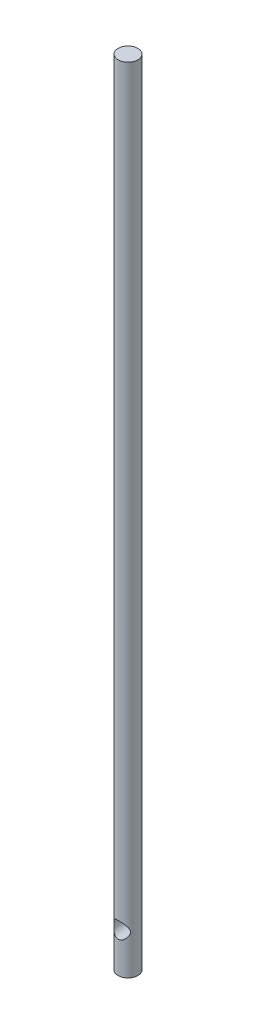
ISO-10303-21;
HEADER;
FILE_DESCRIPTION(('STEP AP214'),'2;1');
FILE_NAME('part.step','',(''),(''),'','','');
FILE_SCHEMA(('AUTOMOTIVE_DESIGN { 1 0 10303 214 1 1 1 1 }'));
ENDSEC;
DATA;
#1=APPLICATION_CONTEXT('core data for automotive mechanical design processes');
#2=APPLICATION_PROTOCOL_DEFINITION('international standard','automotive_design',2000,#1);
#3=PRODUCT_CONTEXT('',#1,'mechanical');
#4=PRODUCT('Part','Part','',(#3));
#5=PRODUCT_RELATED_PRODUCT_CATEGORY('part','',(#4));
#6=PRODUCT_DEFINITION_FORMATION('','',#4);
#7=PRODUCT_DEFINITION_CONTEXT('part definition',#1,'design');
#8=PRODUCT_DEFINITION('design','',#6,#7);
#9=PRODUCT_DEFINITION_SHAPE('','',#8);
#10=(LENGTH_UNIT() NAMED_UNIT(*) SI_UNIT(.MILLI.,.METRE.));
#11=(NAMED_UNIT(*) PLANE_ANGLE_UNIT() SI_UNIT($,.RADIAN.));
#12=(NAMED_UNIT(*) SI_UNIT($,.STERADIAN.) SOLID_ANGLE_UNIT());
#13=UNCERTAINTY_MEASURE_WITH_UNIT(LENGTH_MEASURE(1.E-05),#10,'distance_accuracy_value','');
#14=(GEOMETRIC_REPRESENTATION_CONTEXT(3) GLOBAL_UNCERTAINTY_ASSIGNED_CONTEXT((#13)) GLOBAL_UNIT_ASSIGNED_CONTEXT((#10,
#11,#12)) REPRESENTATION_CONTEXT('',''));
#15=CARTESIAN_POINT('',(0.,0.,0.));
#16=DIRECTION('',(0.,0.,1.));
#17=DIRECTION('',(1.,0.,0.));
#18=AXIS2_PLACEMENT_3D('',#15,#16,#17);
#19=CARTESIAN_POINT('',(0.,254.,0.));
#20=DIRECTION('',(0.,-1.,0.));
#21=DIRECTION('',(0.,0.,-1.));
#22=AXIS2_PLACEMENT_3D('',#19,#20,#21);
#23=CYLINDRICAL_SURFACE('',#22,3.175);
#24=CARTESIAN_POINT('',(0.,254.,0.));
#25=DIRECTION('',(0.,1.,0.));
#26=DIRECTION('',(0.,0.,1.));
#27=AXIS2_PLACEMENT_3D('',#24,#25,#26);
#28=CIRCLE('',#27,3.175);
#29=CARTESIAN_POINT('',(0.,254.,3.175));
#30=VERTEX_POINT('',#29);
#31=EDGE_CURVE('E10',#30,#30,#28,.T.);
#32=ORIENTED_EDGE('',*,*,#31,.F.);
#33=EDGE_LOOP('',(#32));
#34=FACE_BOUND('',#33,.T.);
#35=CARTESIAN_POINT('',(0.,0.,0.));
#36=DIRECTION('',(0.,1.,0.));
#37=DIRECTION('',(0.,0.,1.));
#38=AXIS2_PLACEMENT_3D('',#35,#36,#37);
#39=CIRCLE('',#38,3.175);
#40=CARTESIAN_POINT('',(0.,0.,3.175));
#41=VERTEX_POINT('',#40);
#42=EDGE_CURVE('E46',#41,#41,#39,.T.);
#43=ORIENTED_EDGE('',*,*,#42,.T.);
#44=EDGE_LOOP('',(#43));
#45=FACE_BOUND('',#44,.T.);
#46=CARTESIAN_POINT('',(-2.6035,12.7,1.81725417869928));
#47=CARTESIAN_POINT('',(-2.60349380703893,12.6056522915322,1.81726960519073));
#48=CARTESIAN_POINT('',(-2.59830904840763,12.5111405078217,1.82475945800133));
#49=CARTESIAN_POINT('',(-2.57808860042119,12.3251602366585,1.85320291134145));
#50=CARTESIAN_POINT('',(-2.56301943103733,12.2337032065457,1.87420226598136));
#51=CARTESIAN_POINT('',(-2.51694337247042,12.022627240234,1.93586405062697));
#52=CARTESIAN_POINT('',(-2.48209442276684,11.9051761393774,1.9809339390405));
#53=CARTESIAN_POINT('',(-2.39841904985947,11.6800407597469,2.08146538459981));
#54=CARTESIAN_POINT('',(-2.34954960473287,11.572387907154,2.13695874238255));
#55=CARTESIAN_POINT('',(-2.25541715860351,11.3969043389212,2.23537692454373));
#56=CARTESIAN_POINT('',(-2.2133430346896,11.3266945022097,2.27718022507128));
#57=CARTESIAN_POINT('',(-2.12304867110549,11.1908489097998,2.36159191688069));
#58=CARTESIAN_POINT('',(-2.07482597637227,11.1252149975039,2.40420062393305));
#59=CARTESIAN_POINT('',(-1.92114005012042,10.9353666398222,2.53129287769606));
#60=CARTESIAN_POINT('',(-1.80650430308042,10.8179184294719,2.61521372312124));
#61=CARTESIAN_POINT('',(-1.57945159624831,10.62615817513,2.75681725436884));
#62=CARTESIAN_POINT('',(-1.47145254679039,10.5479453202648,2.8163418253493));
#63=CARTESIAN_POINT('',(-1.24097732698785,10.40733046106,2.92519319791981));
#64=CARTESIAN_POINT('',(-1.11852469347476,10.3449032578057,2.97453622901349));
#65=CARTESIAN_POINT('',(-0.882754596866585,10.2479896804999,3.05189691940021));
#66=CARTESIAN_POINT('',(-0.771369427082402,10.2105688311945,3.08210619165948));
#67=CARTESIAN_POINT('',(-0.542099638614502,10.150815481225,3.13056626479759));
#68=CARTESIAN_POINT('',(-0.424218717568863,10.1284744905443,3.14882379437707));
#69=CARTESIAN_POINT('',(-0.184702399776175,10.1002525297829,3.17191312658879));
#70=CARTESIAN_POINT('',(-0.0630542442020657,10.0944355623768,3.17669272448434));
#71=CARTESIAN_POINT('',(0.17959843960946,10.0998688596393,3.1722376933656));
#72=CARTESIAN_POINT('',(0.300602973008788,10.1111189872204,3.16300317691645));
#73=CARTESIAN_POINT('',(0.530754495807862,10.1486722187031,3.13234403759877));
#74=CARTESIAN_POINT('',(0.640171714002752,10.1739998535061,3.1117098386675));
#75=CARTESIAN_POINT('',(0.852647558606556,10.237579592308,3.06032310242028));
#76=CARTESIAN_POINT('',(0.955704504285416,10.2758350954051,3.0295679040662));
#77=CARTESIAN_POINT('',(1.16279452849434,10.3676001702961,2.95662894565898));
#78=CARTESIAN_POINT('',(1.2660745726746,10.4221756446305,2.91366368632402));
#79=CARTESIAN_POINT('',(1.46207443006603,10.5427311167065,2.82041889385542));
#80=CARTESIAN_POINT('',(1.55478943860704,10.608716269169,2.77013605638324));
#81=CARTESIAN_POINT('',(1.74736466909495,10.7652216438746,2.65376673632885));
#82=CARTESIAN_POINT('',(1.84471745269194,10.8579919915534,2.58656568240451));
#83=CARTESIAN_POINT('',(2.02339604233255,11.0562445223615,2.44932530286629));
#84=CARTESIAN_POINT('',(2.10469763983113,11.1617455256786,2.37928187928248));
#85=CARTESIAN_POINT('',(2.24848726914475,11.3812196890884,2.24373588676196));
#86=CARTESIAN_POINT('',(2.31150741926269,11.4947985976659,2.1781597457541));
#87=CARTESIAN_POINT('',(2.421176492926,11.7338994443531,2.05553877920543));
#88=CARTESIAN_POINT('',(2.46786131888551,11.8593944105906,1.99847540447658));
#89=CARTESIAN_POINT('',(2.52912696585605,12.0759078545479,1.91981912423537));
#90=CARTESIAN_POINT('',(2.54922138731441,12.1633570383594,1.89282496311961));
#91=CARTESIAN_POINT('',(2.58042133786671,12.3424311995639,1.85007036811106));
#92=CARTESIAN_POINT('',(2.59154938910397,12.4340450997925,1.83428179946868));
#93=CARTESIAN_POINT('',(2.60395334095436,12.6201217578389,1.81664298167926));
#94=CARTESIAN_POINT('',(2.60514737674104,12.7146017602056,1.81490855376892));
#95=CARTESIAN_POINT('',(2.59733303011709,12.9023006848884,1.82606625849704));
#96=CARTESIAN_POINT('',(2.58831318049629,12.995518070649,1.83897483097672));
#97=CARTESIAN_POINT('',(2.55818983228077,13.1961278594062,1.88070528016295));
#98=CARTESIAN_POINT('',(2.53503143895886,13.3026294075129,1.91219215437187));
#99=CARTESIAN_POINT('',(2.47715409814926,13.5083438569671,1.98658919501497));
#100=CARTESIAN_POINT('',(2.44239853217996,13.6075324405335,2.02953545771445));
#101=CARTESIAN_POINT('',(2.37187757105399,13.7764456503839,2.11116922838265));
#102=CARTESIAN_POINT('',(2.33818697759601,13.847696130628,2.14856077116875));
#103=CARTESIAN_POINT('',(2.26508109926628,13.9859784609942,2.22550176038988));
#104=CARTESIAN_POINT('',(2.22566296224328,14.0530081853242,2.26505227576864));
#105=CARTESIAN_POINT('',(2.09898018038973,14.24808755516,2.38503209760888));
#106=CARTESIAN_POINT('',(2.0033061695786,14.3700826149601,2.46676624298374));
#107=CARTESIAN_POINT('',(1.84210171074324,14.5415311546607,2.58688783587489));
#108=CARTESIAN_POINT('',(1.78450998934586,14.5974319232116,2.62704185301191));
#109=CARTESIAN_POINT('',(1.66355898166607,14.7043201667134,2.70524849645464));
#110=CARTESIAN_POINT('',(1.60019956353601,14.7553075292905,2.74330107469019));
#111=CARTESIAN_POINT('',(1.46797932136913,14.8517255573894,2.81626530862939));
#112=CARTESIAN_POINT('',(1.39913273588328,14.8971698770936,2.85118462395024));
#113=CARTESIAN_POINT('',(1.2560546202533,14.9819850768829,2.91704561602491));
#114=CARTESIAN_POINT('',(1.18182574004628,15.0213589162747,2.94798922966511));
#115=CARTESIAN_POINT('',(0.999413105069468,15.106859448454,3.01570335266716));
#116=CARTESIAN_POINT('',(0.888951563089914,15.14996386044,3.0502940300014));
#117=CARTESIAN_POINT('',(0.660433666577564,15.2211783058276,3.10778240966677));
#118=CARTESIAN_POINT('',(0.542383240561657,15.2492998882162,3.1306891175921));
#119=CARTESIAN_POINT('',(0.301034653873178,15.2889386678215,3.16304955150389));
#120=CARTESIAN_POINT('',(0.17771295827243,15.3003711105559,3.17243460571653));
#121=CARTESIAN_POINT('',(-0.0695487107797201,15.3055053283863,3.17664410680545));
#122=CARTESIAN_POINT('',(-0.193488604293607,15.2992093394575,3.17147038988767));
#123=CARTESIAN_POINT('',(-0.428208810946593,15.2705517809296,3.14802958864769));
#124=CARTESIAN_POINT('',(-0.539260005543841,15.2494857953008,3.13081865904161));
#125=CARTESIAN_POINT('',(-0.755647208780163,15.1939321240832,3.08574914882455));
#126=CARTESIAN_POINT('',(-0.86098238909654,15.1594424991261,3.0578890296919));
#127=CARTESIAN_POINT('',(-1.07072462242002,15.0759901930671,2.99116521603351));
#128=CARTESIAN_POINT('',(-1.17461764477316,15.0262266017417,2.95169965368096));
#129=CARTESIAN_POINT('',(-1.37254157716372,14.9152300957006,2.86504169788145));
#130=CARTESIAN_POINT('',(-1.46656491895476,14.8539884782238,2.81784344486658));
#131=CARTESIAN_POINT('',(-1.68524901110361,14.6910734064275,2.69493634929465));
#132=CARTESIAN_POINT('',(-1.80403918577009,14.5837795783829,2.61611808882817));
#133=CARTESIAN_POINT('',(-1.96516590073709,14.409567353474,2.49465758406211));
#134=CARTESIAN_POINT('',(-2.01609578271388,14.3491832441239,2.45356727170546));
#135=CARTESIAN_POINT('',(-2.11224457503145,14.2240887104516,2.37129603165292));
#136=CARTESIAN_POINT('',(-2.15746514344285,14.1593795505773,2.33011513381555));
#137=CARTESIAN_POINT('',(-2.26728826205007,13.985917221163,2.22458028123042));
#138=CARTESIAN_POINT('',(-2.32744666809876,13.8738351577155,2.16099283135988));
#139=CARTESIAN_POINT('',(-2.43194934699224,13.6382725322719,2.0426543650848));
#140=CARTESIAN_POINT('',(-2.47633599046081,13.5148236493447,1.98787989299024));
#141=CARTESIAN_POINT('',(-2.53529061200704,13.2988236228063,1.91166237827773));
#142=CARTESIAN_POINT('',(-2.55486432902738,13.2094574558188,1.88518150104208));
#143=CARTESIAN_POINT('',(-2.58457629617021,13.0266045031825,1.8442487329831));
#144=CARTESIAN_POINT('',(-2.59475037550997,12.9331347992831,1.82975118696474));
#145=CARTESIAN_POINT('',(-2.60102447982524,12.8158660417275,1.82079575180876));
#146=CARTESIAN_POINT('',(-2.60195127919733,12.7927266651667,1.81947139270039));
#147=CARTESIAN_POINT('',(-2.60318985311492,12.7463948389957,1.81769863473896));
#148=CARTESIAN_POINT('',(-2.60350152299875,12.723202381026,1.81725038495232));
#149=CARTESIAN_POINT('',(-2.6035,12.7,1.81725417869928));
#150=B_SPLINE_CURVE_WITH_KNOTS('',3,(#46,#47,#48,#49,#50,#51,#52,#53,#54,#55,#56,#57,#58,#59,
#60,#61,#62,#63,#64,#65,#66,#67,#68,#69,#70,#71,#72,#73,#74,#75,#76,#77,#78,#79,#80,#81,#82,#83,
#84,#85,#86,#87,#88,#89,#90,#91,#92,#93,#94,#95,#96,#97,#98,#99,#100,#101,#102,#103,#104,#105,
#106,#107,#108,#109,#110,#111,#112,#113,#114,#115,#116,#117,#118,#119,#120,#121,#122,#123,#124,
#125,#126,#127,#128,#129,#130,#131,#132,#133,#134,#135,#136,#137,#138,#139,#140,#141,#142,#143,
#144,#145,#146,#147,#148,#149),.UNSPECIFIED.,.T.,.F.,(4,2,2,2,2,2,2,2,2,2,2,2,2,2,2,2,2,2,2,2,2,
2,2,2,2,2,2,2,2,2,2,2,2,2,2,2,2,2,2,2,2,2,2,2,2,2,2,2,2,2,2,4),(0.,0.282939510307461,
0.566842363978402,0.956270704776369,1.34690702768739,1.62230695710978,1.89781719737606,
2.44774539088221,2.88426263354912,3.32007859335296,3.68252927239652,4.04477571977009,
4.40842335953074,4.77206807839133,5.11319028142708,5.45440224490685,5.82644196446266,
6.1986502072396,6.64806919839079,7.09816091444782,7.53340602702877,7.96768844192595,
8.24785671153458,8.52731902827849,8.80908209660933,9.09116181647814,9.42962283661693,
9.76916283494952,10.0305293359004,10.2920264387289,10.8151808853685,11.0841598691664,
11.3531450032797,11.6214535587844,11.8896308997666,12.2585823277594,12.6272489495626,
12.9977813798354,13.3682670792854,13.7097644119182,14.0513111003958,14.4152597845521,
14.7794855430674,15.3117004825252,15.5786168057556,15.8454554332829,16.2708086130978,
16.6950102905371,16.9797499495292,17.2633997147977,17.3329695404304,17.4025512020528),.UNSPECIFIED.);
#151=CARTESIAN_POINT('',(-2.6035,12.7,1.81725417869928));
#152=VERTEX_POINT('',#151);
#153=EDGE_CURVE('E52',#152,#152,#150,.T.);
#154=ORIENTED_EDGE('',*,*,#153,.F.);
#155=EDGE_LOOP('',(#154));
#156=FACE_BOUND('',#155,.T.);
#157=CARTESIAN_POINT('',(0.,15.3035,-3.175));
#158=CARTESIAN_POINT('',(0.124123475975316,15.3034893581908,-3.17498963844609));
#159=CARTESIAN_POINT('',(0.248399817811967,15.2945499532605,-3.16764822022756));
#160=CARTESIAN_POINT('',(0.492915685238949,15.2594097445048,-3.13893180286522));
#161=CARTESIAN_POINT('',(0.613147071737957,15.233176097969,-3.11753010274403));
#162=CARTESIAN_POINT('',(0.845370064526018,15.1653814220387,-3.06269871701765));
#163=CARTESIAN_POINT('',(0.957408835942439,15.123918058066,-3.02934570561062));
#164=CARTESIAN_POINT('',(1.1719899729014,15.0277668764952,-2.95297497446787));
#165=CARTESIAN_POINT('',(1.27453147910821,14.9730778638216,-2.90995638137086));
#166=CARTESIAN_POINT('',(1.50418874828168,14.8307009338172,-2.79992252111318));
#167=CARTESIAN_POINT('',(1.62685974340384,14.7382213815472,-2.72984396144292));
#168=CARTESIAN_POINT('',(1.85222572926917,14.5358996551492,-2.58226149625843));
#169=CARTESIAN_POINT('',(1.95486191966328,14.4260080387235,-2.50473670147969));
#170=CARTESIAN_POINT('',(2.09419892563397,14.2486486776039,-2.38720547545905));
#171=CARTESIAN_POINT('',(2.13853064808069,14.1868430792235,-2.34746698005741));
#172=CARTESIAN_POINT('',(2.22185003224186,14.0591943987958,-2.26876311834293));
#173=CARTESIAN_POINT('',(2.26083592730141,13.9933499923837,-2.2297980112354));
#174=CARTESIAN_POINT('',(2.33318274771518,13.8577398573863,-2.15397803623534));
#175=CARTESIAN_POINT('',(2.36655779505138,13.7879845812898,-2.11711802939653));
#176=CARTESIAN_POINT('',(2.42746797872266,13.6442963754813,-2.04699254721169));
#177=CARTESIAN_POINT('',(2.4550081415199,13.5703671115664,-2.01372399022972));
#178=CARTESIAN_POINT('',(2.50658873716791,13.40934482567,-1.94923911746055));
#179=CARTESIAN_POINT('',(2.52985620476328,13.3217181629825,-1.91870498324858));
#180=CARTESIAN_POINT('',(2.56739303486915,13.1417193499684,-1.86818689698901));
#181=CARTESIAN_POINT('',(2.58168481380992,13.0493596498964,-1.84817668237134));
#182=CARTESIAN_POINT('',(2.60028691219318,12.8605602665468,-1.82192817278465));
#183=CARTESIAN_POINT('',(2.60448888485103,12.7640875203457,-1.81583940257808));
#184=CARTESIAN_POINT('',(2.60211315740838,12.571537150346,-1.81923902416289));
#185=CARTESIAN_POINT('',(2.59553081649723,12.4754597144996,-1.82873412215904));
#186=CARTESIAN_POINT('',(2.57094397805907,12.2760690024166,-1.86315400856163));
#187=CARTESIAN_POINT('',(2.55170022727413,12.1732135391498,-1.88974469136245));
#188=CARTESIAN_POINT('',(2.50232253625902,11.9739084648961,-1.95464781624411));
#189=CARTESIAN_POINT('',(2.47215411497205,11.8774802940466,-1.992997312748));
#190=CARTESIAN_POINT('',(2.41011212928528,11.7123202113051,-2.06731302203853));
#191=CARTESIAN_POINT('',(2.38013051431427,11.6422189185222,-2.10189249500399));
#192=CARTESIAN_POINT('',(2.3147744528378,11.5059559661491,-2.17366213153368));
#193=CARTESIAN_POINT('',(2.27939711926159,11.4397964421815,-2.21085368695476));
#194=CARTESIAN_POINT('',(2.16543772342221,11.2469181152341,-2.32442703413847));
#195=CARTESIAN_POINT('',(2.07905422537912,11.1258671508787,-2.40277435290892));
#196=CARTESIAN_POINT('',(1.88227893075193,10.8946766809139,-2.56012511257142));
#197=CARTESIAN_POINT('',(1.77105880109226,10.7851748312205,-2.63902738873259));
#198=CARTESIAN_POINT('',(1.52707791149911,10.5855394009579,-2.78727841350138));
#199=CARTESIAN_POINT('',(1.39437058393798,10.4953590337454,-2.85665009058513));
#200=CARTESIAN_POINT('',(1.14717455706694,10.3598303714,-2.96269415784094));
#201=CARTESIAN_POINT('',(1.03734481071853,10.3089448591673,-3.00314655826614));
#202=CARTESIAN_POINT('',(0.808472770456197,10.2221942364831,-3.07266264818784));
#203=CARTESIAN_POINT('',(0.689437039605895,10.1863185401902,-3.10173436310676));
#204=CARTESIAN_POINT('',(0.444137934137701,10.1315699656462,-3.14626597447226));
#205=CARTESIAN_POINT('',(0.317832509624801,10.112809427501,-3.16163592073425));
#206=CARTESIAN_POINT('',(0.0629120037225274,10.0941295640756,-3.17693912736037));
#207=CARTESIAN_POINT('',(-0.0657020679860051,10.0942021936836,-3.17687897911894));
#208=CARTESIAN_POINT('',(-0.307380967024334,10.112164759431,-3.16216462368221));
#209=CARTESIAN_POINT('',(-0.420683678390816,10.1282200119678,-3.14901320282353));
#210=CARTESIAN_POINT('',(-0.642383248668994,10.1744534621768,-3.11136927044028));
#211=CARTESIAN_POINT('',(-0.75077921857971,10.2046342079558,-3.08687471272837));
#212=CARTESIAN_POINT('',(-0.964119386725462,10.2788642094524,-3.02717779548715));
#213=CARTESIAN_POINT('',(-1.06880671667246,10.3233653623829,-2.99162801371886));
#214=CARTESIAN_POINT('',(-1.26901924959805,10.4239559720396,-2.91235960230411));
#215=CARTESIAN_POINT('',(-1.36454176445306,10.4800488135904,-2.86863858697831));
#216=CARTESIAN_POINT('',(-1.58678190557676,10.6298485880595,-2.75401917991626));
#217=CARTESIAN_POINT('',(-1.70808861490191,10.7290981722438,-2.67976797972566));
#218=CARTESIAN_POINT('',(-1.87403957004748,10.8910751115127,-2.56382769666463));
#219=CARTESIAN_POINT('',(-1.92679707161641,10.9474043435339,-2.52431861471154));
#220=CARTESIAN_POINT('',(-2.02691784622181,11.0642350861497,-2.44464891997432));
#221=CARTESIAN_POINT('',(-2.07428337510764,11.1247348347821,-2.40448858774876));
#222=CARTESIAN_POINT('',(-2.16433735799769,11.2508734660719,-2.32378756743908));
#223=CARTESIAN_POINT('',(-2.20693199095684,11.3165825337329,-2.2832521174344));
#224=CARTESIAN_POINT('',(-2.28640153755374,11.4522954993897,-2.20366818575309));
#225=CARTESIAN_POINT('',(-2.32327376010173,11.522301396599,-2.16462041016165));
#226=CARTESIAN_POINT('',(-2.39086352498482,11.6664187065179,-2.08971969393378));
#227=CARTESIAN_POINT('',(-2.4216077188949,11.7405104687395,-2.05385331274569));
#228=CARTESIAN_POINT('',(-2.47664506007239,11.8931462093896,-1.98713910557181));
#229=CARTESIAN_POINT('',(-2.50094648664365,11.9716843148846,-1.95628485867469));
#230=CARTESIAN_POINT('',(-2.54327599370942,12.1365419418237,-1.90095794348242));
#231=CARTESIAN_POINT('',(-2.56100550798422,12.2230485609389,-1.87679933394888));
#232=CARTESIAN_POINT('',(-2.58765349222321,12.3996743541574,-1.83989414331906));
#233=CARTESIAN_POINT('',(-2.59659432871273,12.4897837473916,-1.82711860097366));
#234=CARTESIAN_POINT('',(-2.60495254879583,12.6719743701564,-1.81518976727652));
#235=CARTESIAN_POINT('',(-2.60430968129299,12.7640644369915,-1.81612265795785));
#236=CARTESIAN_POINT('',(-2.59341679087731,12.9465617189978,-1.83163548536389));
#237=CARTESIAN_POINT('',(-2.58315195253364,13.0369661196851,-1.84623646748739));
#238=CARTESIAN_POINT('',(-2.5499767392694,13.2373457338147,-1.89188125022431));
#239=CARTESIAN_POINT('',(-2.52441782222473,13.3460856322685,-1.92627916500783));
#240=CARTESIAN_POINT('',(-2.46129495688757,13.5557524115751,-2.00629861106378));
#241=CARTESIAN_POINT('',(-2.42369344788067,13.6566536035454,-2.051955153997));
#242=CARTESIAN_POINT('',(-2.34811300923829,13.8274201085521,-2.13762622484277));
#243=CARTESIAN_POINT('',(-2.3123694365922,13.8989419316214,-2.17638361196672));
#244=CARTESIAN_POINT('',(-2.23498804969184,14.0376677938319,-2.25577612111846));
#245=CARTESIAN_POINT('',(-2.19334745554497,14.1048697747248,-2.29641212261645));
#246=CARTESIAN_POINT('',(-2.10429577317292,14.2350471754542,-2.37828173675714));
#247=CARTESIAN_POINT('',(-2.05688038011102,14.2980193872737,-2.41951577478703));
#248=CARTESIAN_POINT('',(-1.95637146026666,14.4196090843916,-2.501491203949));
#249=CARTESIAN_POINT('',(-1.90327499764468,14.4782242913211,-2.54223232813258));
#250=CARTESIAN_POINT('',(-1.73319854916754,14.6494667705426,-2.66387797753869));
#251=CARTESIAN_POINT('',(-1.60709272871659,14.7550378490434,-2.74259807229653));
#252=CARTESIAN_POINT('',(-1.40107169928096,14.8959321412804,-2.85020133536393));
#253=CARTESIAN_POINT('',(-1.32964369896841,14.9399617146146,-2.88430266583609));
#254=CARTESIAN_POINT('',(-1.18137409748016,15.0215773493966,-2.94813161513575));
#255=CARTESIAN_POINT('',(-1.10453586658902,15.0591673730986,-2.9778619218453));
#256=CARTESIAN_POINT('',(-0.918815482353846,15.1387236442481,-3.04122104053274));
#257=CARTESIAN_POINT('',(-0.807938741999659,15.1778137225613,-3.07272413283516));
#258=CARTESIAN_POINT('',(-0.579524537035591,15.2409306364849,-3.12384313970281));
#259=CARTESIAN_POINT('',(-0.462004057715192,15.2649941444195,-3.14348799034806));
#260=CARTESIAN_POINT('',(-0.286186339215534,15.2883557663721,-3.16259123109925));
#261=CARTESIAN_POINT('',(-0.22921289113296,15.2940230137984,-3.16723273070072));
#262=CARTESIAN_POINT('',(-0.114837276221362,15.3015980735956,-3.17343990585332));
#263=CARTESIAN_POINT('',(-0.0574350034855305,15.3035049242284,-3.17500479454737));
#264=CARTESIAN_POINT('',(0.,15.3035,-3.175));
#265=B_SPLINE_CURVE_WITH_KNOTS('',3,(#157,#158,#159,#160,#161,#162,#163,#164,#165,#166,#167,
#168,#169,#170,#171,#172,#173,#174,#175,#176,#177,#178,#179,#180,#181,#182,#183,#184,#185,#186,
#187,#188,#189,#190,#191,#192,#193,#194,#195,#196,#197,#198,#199,#200,#201,#202,#203,#204,#205,
#206,#207,#208,#209,#210,#211,#212,#213,#214,#215,#216,#217,#218,#219,#220,#221,#222,#223,#224,
#225,#226,#227,#228,#229,#230,#231,#232,#233,#234,#235,#236,#237,#238,#239,#240,#241,#242,#243,
#244,#245,#246,#247,#248,#249,#250,#251,#252,#253,#254,#255,#256,#257,#258,#259,#260,#261,#262,
#263,#264),.UNSPECIFIED.,.T.,.F.,(4,2,2,2,2,2,2,2,2,2,2,2,2,2,2,2,2,2,2,2,2,2,2,2,2,2,2,2,2,2,2,
2,2,2,2,2,2,2,2,2,2,2,2,2,2,2,2,2,2,2,2,2,2,4),(0.,0.372121110694422,0.744950943333154,
1.11543047898384,1.48594350384491,1.98985717146685,2.49522824914305,2.75246608989209,
3.00978873712747,3.2664537027931,3.5228966572058,3.80899396390969,4.09437388234913,
4.3828048387436,4.67135994815551,4.9934707245097,5.31660715494333,5.56744032301251,
5.81840817754302,6.32058007927764,6.84302172556954,7.3641836209561,7.74557593347972,
8.12669880951134,8.5103056608347,8.89374864408524,9.23772429777365,9.58176202538152,
9.93794272365023,10.2942275756089,10.811523950299,11.0714401134857,11.331247132299,
11.5954965586165,11.8598698799377,12.1230670389827,12.3859243178263,12.6595749069379,
12.9325272587596,13.2071963347532,13.4822890284081,13.8309834168996,14.1807761477987,
14.4470195601506,14.7133889016922,14.9799580383926,15.2466656030871,15.7900820157553,
16.0614094448483,16.3325693218519,16.696162261493,17.0588643491009,17.2310099730123,
17.4031996182171),.UNSPECIFIED.);
#266=CARTESIAN_POINT('',(0.,15.3035,-3.175));
#267=VERTEX_POINT('',#266);
#268=EDGE_CURVE('E38',#267,#267,#265,.T.);
#269=ORIENTED_EDGE('',*,*,#268,.F.);
#270=EDGE_LOOP('',(#269));
#271=FACE_BOUND('',#270,.T.);
#272=ADVANCED_FACE('F34',(#34,#45,#156,#271),#23,.T.);
#273=CARTESIAN_POINT('',(0.,254.,0.));
#274=DIRECTION('',(0.,1.,0.));
#275=DIRECTION('',(0.,0.,1.));
#276=AXIS2_PLACEMENT_3D('',#273,#274,#275);
#277=PLANE('',#276);
#278=ORIENTED_EDGE('',*,*,#31,.T.);
#279=EDGE_LOOP('',(#278));
#280=FACE_BOUND('',#279,.T.);
#281=ADVANCED_FACE('F63',(#280),#277,.T.);
#282=CARTESIAN_POINT('',(0.,0.,0.));
#283=DIRECTION('',(0.,1.,0.));
#284=DIRECTION('',(0.,0.,1.));
#285=AXIS2_PLACEMENT_3D('',#282,#283,#284);
#286=PLANE('',#285);
#287=ORIENTED_EDGE('',*,*,#42,.F.);
#288=EDGE_LOOP('',(#287));
#289=FACE_BOUND('',#288,.T.);
#290=ADVANCED_FACE('F61',(#289),#286,.F.);
#291=CARTESIAN_POINT('',(0.,12.7,254.));
#292=DIRECTION('',(0.,0.,-1.));
#293=DIRECTION('',(-1.,0.,0.));
#294=AXIS2_PLACEMENT_3D('',#291,#292,#293);
#295=CYLINDRICAL_SURFACE('',#294,2.6035);
#296=ORIENTED_EDGE('',*,*,#153,.T.);
#297=EDGE_LOOP('',(#296));
#298=FACE_BOUND('',#297,.T.);
#299=ORIENTED_EDGE('',*,*,#268,.T.);
#300=EDGE_LOOP('',(#299));
#301=FACE_BOUND('',#300,.T.);
#302=ADVANCED_FACE('F57',(#298,#301),#295,.F.);
#303=CLOSED_SHELL('',(#272,#281,#290,#302));
#304=MANIFOLD_SOLID_BREP('B2',#303);
#305=ADVANCED_BREP_SHAPE_REPRESENTATION('',(#18,#304),#14);
#306=SHAPE_DEFINITION_REPRESENTATION(#9,#305);
ENDSEC;
END-ISO-10303-21;
